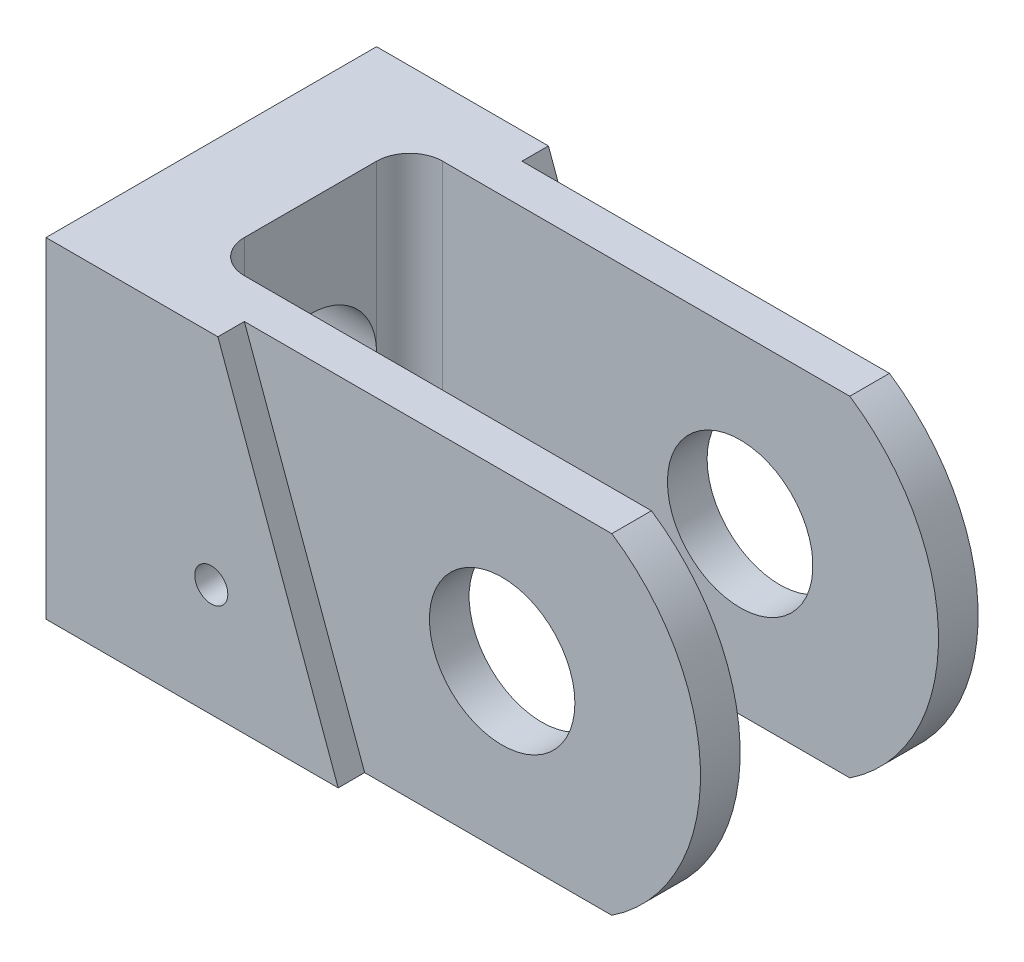
ISO-10303-21;
HEADER;
FILE_DESCRIPTION(('STEP AP214'),'2;1');
FILE_NAME('part.step','',(''),(''),'','','');
FILE_SCHEMA(('AUTOMOTIVE_DESIGN { 1 0 10303 214 1 1 1 1 }'));
ENDSEC;
DATA;
#1=APPLICATION_CONTEXT('core data for automotive mechanical design processes');
#2=APPLICATION_PROTOCOL_DEFINITION('international standard','automotive_design',2000,#1);
#3=PRODUCT_CONTEXT('',#1,'mechanical');
#4=PRODUCT('Part','Part','',(#3));
#5=PRODUCT_RELATED_PRODUCT_CATEGORY('part','',(#4));
#6=PRODUCT_DEFINITION_FORMATION('','',#4);
#7=PRODUCT_DEFINITION_CONTEXT('part definition',#1,'design');
#8=PRODUCT_DEFINITION('design','',#6,#7);
#9=PRODUCT_DEFINITION_SHAPE('','',#8);
#10=(LENGTH_UNIT() NAMED_UNIT(*) SI_UNIT(.MILLI.,.METRE.));
#11=(NAMED_UNIT(*) PLANE_ANGLE_UNIT() SI_UNIT($,.RADIAN.));
#12=(NAMED_UNIT(*) SI_UNIT($,.STERADIAN.) SOLID_ANGLE_UNIT());
#13=UNCERTAINTY_MEASURE_WITH_UNIT(LENGTH_MEASURE(1.E-05),#10,'distance_accuracy_value','');
#14=(GEOMETRIC_REPRESENTATION_CONTEXT(3) GLOBAL_UNCERTAINTY_ASSIGNED_CONTEXT((#13)) GLOBAL_UNIT_ASSIGNED_CONTEXT((#10,
#11,#12)) REPRESENTATION_CONTEXT('',''));
#15=CARTESIAN_POINT('',(0.,0.,0.));
#16=DIRECTION('',(0.,0.,1.));
#17=DIRECTION('',(1.,0.,0.));
#18=AXIS2_PLACEMENT_3D('',#15,#16,#17);
#19=CARTESIAN_POINT('',(-31.137339055794,-24.1952789699571,10.));
#20=DIRECTION('',(-1.,0.,0.));
#21=DIRECTION('',(0.,-1.,0.));
#22=AXIS2_PLACEMENT_3D('',#19,#20,#21);
#23=PLANE('',#22);
#24=DIRECTION('',(0.,0.,1.));
#25=VECTOR('',#24,1.);
#26=CARTESIAN_POINT('',(-31.137339055794,25.8047210300429,10.));
#27=LINE('',#26,#25);
#28=CARTESIAN_POINT('',(-31.137339055794,25.8047210300429,15.));
#29=VERTEX_POINT('',#28);
#30=CARTESIAN_POINT('',(-31.137339055794,25.8047210300429,35.));
#31=VERTEX_POINT('',#30);
#32=EDGE_CURVE('E229',#29,#31,#27,.T.);
#33=ORIENTED_EDGE('',*,*,#32,.T.);
#34=DIRECTION('',(0.,1.,0.));
#35=VECTOR('',#34,1.);
#36=CARTESIAN_POINT('',(-31.137339055794,-24.1952789699571,35.));
#37=LINE('',#36,#35);
#38=CARTESIAN_POINT('',(-31.137339055794,0.804721030042921,35.));
#39=VERTEX_POINT('',#38);
#40=EDGE_CURVE('E203',#31,#39,#37,.F.);
#41=ORIENTED_EDGE('',*,*,#40,.T.);
#42=CARTESIAN_POINT('',(-31.137339055794,0.804721030042921,25.));
#43=DIRECTION('',(-1.,0.,0.));
#44=DIRECTION('',(0.,-1.,0.));
#45=AXIS2_PLACEMENT_3D('',#42,#43,#44);
#46=CIRCLE('',#45,10.);
#47=CARTESIAN_POINT('',(-31.137339055794,0.804721030042921,15.));
#48=VERTEX_POINT('',#47);
#49=EDGE_CURVE('E183',#48,#39,#46,.F.);
#50=ORIENTED_EDGE('',*,*,#49,.F.);
#51=DIRECTION('',(0.,1.,0.));
#52=VECTOR('',#51,1.);
#53=CARTESIAN_POINT('',(-31.137339055794,25.8047210300429,15.));
#54=LINE('',#53,#52);
#55=EDGE_CURVE('E196',#48,#29,#54,.T.);
#56=ORIENTED_EDGE('',*,*,#55,.T.);
#57=EDGE_LOOP('',(#33,#41,#50,#56));
#58=FACE_BOUND('',#57,.T.);
#59=ADVANCED_FACE('F37',(#58),#23,.F.);
#60=CARTESIAN_POINT('',(18.862660944206,0.804721030042931,50.));
#61=DIRECTION('',(0.,0.,-1.));
#62=DIRECTION('',(-1.,0.,0.));
#63=AXIS2_PLACEMENT_3D('',#60,#61,#62);
#64=CYLINDRICAL_SURFACE('',#63,30.);
#65=DIRECTION('',(0.,0.,-1.));
#66=VECTOR('',#65,1.);
#67=CARTESIAN_POINT('',(35.445784895983,-24.1952789699571,50.));
#68=LINE('',#67,#66);
#69=CARTESIAN_POINT('',(35.445784895983,-24.1952789699571,46.));
#70=VERTEX_POINT('',#69);
#71=CARTESIAN_POINT('',(35.445784895983,-24.1952789699571,40.));
#72=VERTEX_POINT('',#71);
#73=EDGE_CURVE('E166',#70,#72,#68,.T.);
#74=ORIENTED_EDGE('',*,*,#73,.T.);
#75=CARTESIAN_POINT('',(18.862660944206,0.804721030042931,40.));
#76=DIRECTION('',(0.,0.,1.));
#77=DIRECTION('',(1.,0.,0.));
#78=AXIS2_PLACEMENT_3D('',#75,#76,#77);
#79=CIRCLE('',#78,30.);
#80=CARTESIAN_POINT('',(35.445784895983,25.8047210300429,40.));
#81=VERTEX_POINT('',#80);
#82=EDGE_CURVE('E223',#72,#81,#79,.T.);
#83=ORIENTED_EDGE('',*,*,#82,.T.);
#84=DIRECTION('',(0.,0.,-1.));
#85=VECTOR('',#84,1.);
#86=CARTESIAN_POINT('',(35.445784895983,25.8047210300429,50.));
#87=LINE('',#86,#85);
#88=CARTESIAN_POINT('',(35.445784895983,25.8047210300429,46.));
#89=VERTEX_POINT('',#88);
#90=EDGE_CURVE('E167',#89,#81,#87,.T.);
#91=ORIENTED_EDGE('',*,*,#90,.F.);
#92=CARTESIAN_POINT('',(18.862660944206,0.804721030042931,46.));
#93=DIRECTION('',(0.,0.,1.));
#94=DIRECTION('',(1.,0.,0.));
#95=AXIS2_PLACEMENT_3D('',#92,#93,#94);
#96=CIRCLE('',#95,30.);
#97=EDGE_CURVE('E270',#70,#89,#96,.T.);
#98=ORIENTED_EDGE('',*,*,#97,.F.);
#99=EDGE_LOOP('',(#74,#83,#91,#98));
#100=FACE_BOUND('',#99,.T.);
#101=ADVANCED_FACE('F334',(#100),#64,.T.);
#102=CARTESIAN_POINT('',(18.862660944206,0.804721030042931,50.));
#103=DIRECTION('',(0.,0.,-1.));
#104=DIRECTION('',(-1.,0.,0.));
#105=AXIS2_PLACEMENT_3D('',#102,#103,#104);
#106=CYLINDRICAL_SURFACE('',#105,11.);
#107=CARTESIAN_POINT('',(18.862660944206,0.804721030042931,40.));
#108=DIRECTION('',(0.,0.,1.));
#109=DIRECTION('',(1.,0.,0.));
#110=AXIS2_PLACEMENT_3D('',#107,#108,#109);
#111=CIRCLE('',#110,11.);
#112=CARTESIAN_POINT('',(29.862660944206,0.804721030042931,40.));
#113=VERTEX_POINT('',#112);
#114=EDGE_CURVE('E158',#113,#113,#111,.T.);
#115=ORIENTED_EDGE('',*,*,#114,.F.);
#116=EDGE_LOOP('',(#115));
#117=FACE_BOUND('',#116,.T.);
#118=CARTESIAN_POINT('',(18.862660944206,0.804721030042931,46.));
#119=DIRECTION('',(0.,0.,1.));
#120=DIRECTION('',(1.,0.,0.));
#121=AXIS2_PLACEMENT_3D('',#118,#119,#120);
#122=CIRCLE('',#121,11.);
#123=CARTESIAN_POINT('',(29.862660944206,0.804721030042931,46.));
#124=VERTEX_POINT('',#123);
#125=EDGE_CURVE('E259',#124,#124,#122,.F.);
#126=ORIENTED_EDGE('',*,*,#125,.F.);
#127=EDGE_LOOP('',(#126));
#128=FACE_BOUND('',#127,.T.);
#129=ADVANCED_FACE('F336',(#117,#128),#106,.F.);
#130=CARTESIAN_POINT('',(35.445784895983,25.8047210300429,10.));
#131=VERTEX_POINT('',#130);
#132=CARTESIAN_POINT('',(35.445784895983,25.8047210300429,4.));
#133=VERTEX_POINT('',#132);
#134=EDGE_CURVE('E157',#131,#133,#87,.T.);
#135=ORIENTED_EDGE('',*,*,#134,.F.);
#136=CARTESIAN_POINT('',(18.862660944206,0.804721030042931,10.));
#137=DIRECTION('',(0.,0.,-1.));
#138=DIRECTION('',(-1.,0.,0.));
#139=AXIS2_PLACEMENT_3D('',#136,#137,#138);
#140=CIRCLE('',#139,30.);
#141=CARTESIAN_POINT('',(35.445784895983,-24.1952789699571,10.));
#142=VERTEX_POINT('',#141);
#143=EDGE_CURVE('E144',#131,#142,#140,.T.);
#144=ORIENTED_EDGE('',*,*,#143,.T.);
#145=CARTESIAN_POINT('',(35.445784895983,-24.1952789699571,4.));
#146=VERTEX_POINT('',#145);
#147=EDGE_CURVE('E155',#142,#146,#68,.T.);
#148=ORIENTED_EDGE('',*,*,#147,.T.);
#149=CARTESIAN_POINT('',(18.862660944206,0.804721030042931,4.));
#150=DIRECTION('',(0.,0.,-1.));
#151=DIRECTION('',(-1.,0.,0.));
#152=AXIS2_PLACEMENT_3D('',#149,#150,#151);
#153=CIRCLE('',#152,30.);
#154=EDGE_CURVE('E249',#133,#146,#153,.T.);
#155=ORIENTED_EDGE('',*,*,#154,.F.);
#156=EDGE_LOOP('',(#135,#144,#148,#155));
#157=FACE_BOUND('',#156,.T.);
#158=ADVANCED_FACE('F153',(#157),#64,.T.);
#159=CARTESIAN_POINT('',(18.862660944206,0.804721030042931,10.));
#160=DIRECTION('',(0.,0.,-1.));
#161=DIRECTION('',(-1.,0.,0.));
#162=AXIS2_PLACEMENT_3D('',#159,#160,#161);
#163=CIRCLE('',#162,11.);
#164=CARTESIAN_POINT('',(7.86266094420602,0.804721030042931,10.));
#165=VERTEX_POINT('',#164);
#166=EDGE_CURVE('E159',#165,#165,#163,.T.);
#167=ORIENTED_EDGE('',*,*,#166,.F.);
#168=EDGE_LOOP('',(#167));
#169=FACE_BOUND('',#168,.T.);
#170=CARTESIAN_POINT('',(18.862660944206,0.804721030042931,4.));
#171=DIRECTION('',(0.,0.,-1.));
#172=DIRECTION('',(-1.,0.,0.));
#173=AXIS2_PLACEMENT_3D('',#170,#171,#172);
#174=CIRCLE('',#173,11.);
#175=CARTESIAN_POINT('',(7.86266094420602,0.804721030042931,4.));
#176=VERTEX_POINT('',#175);
#177=EDGE_CURVE('E252',#176,#176,#174,.F.);
#178=ORIENTED_EDGE('',*,*,#177,.F.);
#179=EDGE_LOOP('',(#178));
#180=FACE_BOUND('',#179,.T.);
#181=ADVANCED_FACE('F344',(#169,#180),#106,.F.);
#182=CARTESIAN_POINT('',(18.862660944206,0.804721030042931,50.));
#183=DIRECTION('',(0.,0.,1.));
#184=DIRECTION('',(1.,0.,0.));
#185=AXIS2_PLACEMENT_3D('',#182,#183,#184);
#186=PLANE('',#185);
#187=CARTESIAN_POINT('',(-21.137339055794,-7.19527896995708,50.));
#188=DIRECTION('',(0.,0.,1.));
#189=DIRECTION('',(1.,0.,0.));
#190=AXIS2_PLACEMENT_3D('',#187,#188,#189);
#191=CIRCLE('',#190,2.5);
#192=CARTESIAN_POINT('',(-18.637339055794,-7.19527896995708,50.));
#193=VERTEX_POINT('',#192);
#194=EDGE_CURVE('E605',#193,#193,#191,.T.);
#195=ORIENTED_EDGE('',*,*,#194,.F.);
#196=EDGE_LOOP('',(#195));
#197=FACE_BOUND('',#196,.T.);
#198=DIRECTION('',(1.,0.,0.));
#199=VECTOR('',#198,1.);
#200=CARTESIAN_POINT('',(35.445784895983,-24.1952789699571,50.));
#201=LINE('',#200,#199);
#202=CARTESIAN_POINT('',(-46.137339055794,-24.1952789699571,50.));
#203=VERTEX_POINT('',#202);
#204=CARTESIAN_POINT('',(-1.93882734248404,-24.1952789699571,50.));
#205=VERTEX_POINT('',#204);
#206=EDGE_CURVE('E290',#203,#205,#201,.T.);
#207=ORIENTED_EDGE('',*,*,#206,.T.);
#208=DIRECTION('',(-0.342020143325666,0.93969262078591,0.));
#209=VECTOR('',#208,1.);
#210=CARTESIAN_POINT('',(-7.54036057553245,-8.80519289783177,50.));
#211=LINE('',#210,#209);
#212=CARTESIAN_POINT('',(-20.137339055794,25.8047210300429,50.));
#213=VERTEX_POINT('',#212);
#214=EDGE_CURVE('E274',#205,#213,#211,.T.);
#215=ORIENTED_EDGE('',*,*,#214,.T.);
#216=DIRECTION('',(-1.,0.,0.));
#217=VECTOR('',#216,1.);
#218=CARTESIAN_POINT('',(35.445784895983,25.8047210300429,50.));
#219=LINE('',#218,#217);
#220=CARTESIAN_POINT('',(-46.137339055794,25.8047210300429,50.));
#221=VERTEX_POINT('',#220);
#222=EDGE_CURVE('E294',#213,#221,#219,.T.);
#223=ORIENTED_EDGE('',*,*,#222,.T.);
#224=DIRECTION('',(0.,-1.,0.));
#225=VECTOR('',#224,1.);
#226=CARTESIAN_POINT('',(-46.137339055794,-24.1952789699571,50.));
#227=LINE('',#226,#225);
#228=EDGE_CURVE('E287',#221,#203,#227,.T.);
#229=ORIENTED_EDGE('',*,*,#228,.T.);
#230=EDGE_LOOP('',(#207,#215,#223,#229));
#231=FACE_BOUND('',#230,.T.);
#232=ADVANCED_FACE('F323',(#197,#231),#186,.T.);
#233=CARTESIAN_POINT('',(35.445784895983,-24.1952789699571,50.));
#234=DIRECTION('',(0.,1.,0.));
#235=DIRECTION('',(-1.,0.,0.));
#236=AXIS2_PLACEMENT_3D('',#233,#234,#235);
#237=PLANE('',#236);
#238=DIRECTION('',(-1.,0.,0.));
#239=VECTOR('',#238,1.);
#240=CARTESIAN_POINT('',(-31.137339055794,-24.1952789699571,10.));
#241=LINE('',#240,#239);
#242=CARTESIAN_POINT('',(-26.137339055794,-24.1952789699571,10.));
#243=VERTEX_POINT('',#242);
#244=EDGE_CURVE('E141',#142,#243,#241,.T.);
#245=ORIENTED_EDGE('',*,*,#244,.T.);
#246=CARTESIAN_POINT('',(-26.137339055794,-24.1952789699571,15.));
#247=DIRECTION('',(0.,1.,0.));
#248=DIRECTION('',(-1.,0.,0.));
#249=AXIS2_PLACEMENT_3D('',#246,#247,#248);
#250=CIRCLE('',#249,5.);
#251=CARTESIAN_POINT('',(-31.137339055794,-24.1952789699571,15.));
#252=VERTEX_POINT('',#251);
#253=EDGE_CURVE('E11',#243,#252,#250,.T.);
#254=ORIENTED_EDGE('',*,*,#253,.T.);
#255=DIRECTION('',(0.,0.,1.));
#256=VECTOR('',#255,1.);
#257=CARTESIAN_POINT('',(-31.137339055794,-24.1952789699571,10.));
#258=LINE('',#257,#256);
#259=CARTESIAN_POINT('',(-31.137339055794,-24.1952789699571,35.));
#260=VERTEX_POINT('',#259);
#261=EDGE_CURVE('E149',#252,#260,#258,.T.);
#262=ORIENTED_EDGE('',*,*,#261,.T.);
#263=CARTESIAN_POINT('',(-26.137339055794,-24.1952789699571,35.));
#264=DIRECTION('',(0.,1.,0.));
#265=DIRECTION('',(-1.,0.,0.));
#266=AXIS2_PLACEMENT_3D('',#263,#264,#265);
#267=CIRCLE('',#266,5.);
#268=CARTESIAN_POINT('',(-26.137339055794,-24.1952789699571,40.));
#269=VERTEX_POINT('',#268);
#270=EDGE_CURVE('E208',#260,#269,#267,.T.);
#271=ORIENTED_EDGE('',*,*,#270,.T.);
#272=DIRECTION('',(1.,0.,0.));
#273=VECTOR('',#272,1.);
#274=CARTESIAN_POINT('',(-31.137339055794,-24.1952789699571,40.));
#275=LINE('',#274,#273);
#276=EDGE_CURVE('E213',#269,#72,#275,.T.);
#277=ORIENTED_EDGE('',*,*,#276,.T.);
#278=ORIENTED_EDGE('',*,*,#73,.F.);
#279=DIRECTION('',(1.,0.,0.));
#280=VECTOR('',#279,1.);
#281=CARTESIAN_POINT('',(0.,-24.1952789699571,46.));
#282=LINE('',#281,#280);
#283=CARTESIAN_POINT('',(-1.93882734248404,-24.1952789699571,46.));
#284=VERTEX_POINT('',#283);
#285=EDGE_CURVE('E268',#284,#70,#282,.T.);
#286=ORIENTED_EDGE('',*,*,#285,.F.);
#287=DIRECTION('',(0.,0.,-1.));
#288=VECTOR('',#287,1.);
#289=CARTESIAN_POINT('',(-1.93882734248404,-24.1952789699571,50.000012));
#290=LINE('',#289,#288);
#291=EDGE_CURVE('E272',#205,#284,#290,.T.);
#292=ORIENTED_EDGE('',*,*,#291,.F.);
#293=ORIENTED_EDGE('',*,*,#206,.F.);
#294=DIRECTION('',(0.,0.,-1.));
#295=VECTOR('',#294,1.);
#296=CARTESIAN_POINT('',(-46.137339055794,-24.1952789699571,50.));
#297=LINE('',#296,#295);
#298=CARTESIAN_POINT('',(-46.137339055794,-24.1952789699571,0.));
#299=VERTEX_POINT('',#298);
#300=EDGE_CURVE('E170',#203,#299,#297,.T.);
#301=ORIENTED_EDGE('',*,*,#300,.T.);
#302=DIRECTION('',(1.,0.,0.));
#303=VECTOR('',#302,1.);
#304=CARTESIAN_POINT('',(35.445784895983,-24.1952789699571,0.));
#305=LINE('',#304,#303);
#306=CARTESIAN_POINT('',(-1.93882734248406,-24.1952789699571,0.));
#307=VERTEX_POINT('',#306);
#308=EDGE_CURVE('E299',#299,#307,#305,.T.);
#309=ORIENTED_EDGE('',*,*,#308,.T.);
#310=DIRECTION('',(0.,0.,1.));
#311=VECTOR('',#310,1.);
#312=CARTESIAN_POINT('',(-1.93882734248406,-24.1952789699571,-1.2E-05));
#313=LINE('',#312,#311);
#314=CARTESIAN_POINT('',(-1.93882734248406,-24.1952789699571,4.));
#315=VERTEX_POINT('',#314);
#316=EDGE_CURVE('E255',#307,#315,#313,.T.);
#317=ORIENTED_EDGE('',*,*,#316,.T.);
#318=DIRECTION('',(-1.,0.,0.));
#319=VECTOR('',#318,1.);
#320=CARTESIAN_POINT('',(0.,-24.1952789699571,4.));
#321=LINE('',#320,#319);
#322=EDGE_CURVE('E165',#146,#315,#321,.T.);
#323=ORIENTED_EDGE('',*,*,#322,.F.);
#324=ORIENTED_EDGE('',*,*,#147,.F.);
#325=EDGE_LOOP('',(#245,#254,#262,#271,#277,#278,#286,#292,#293,#301,#309,#317,#323,#324));
#326=FACE_BOUND('',#325,.T.);
#327=ADVANCED_FACE('F162',(#326),#237,.F.);
#328=CARTESIAN_POINT('',(35.445784895983,25.8047210300429,50.));
#329=DIRECTION('',(0.,-1.,0.));
#330=DIRECTION('',(1.,0.,0.));
#331=AXIS2_PLACEMENT_3D('',#328,#329,#330);
#332=PLANE('',#331);
#333=ORIENTED_EDGE('',*,*,#90,.T.);
#334=DIRECTION('',(1.,0.,0.));
#335=VECTOR('',#334,1.);
#336=CARTESIAN_POINT('',(-31.137339055794,25.8047210300429,40.));
#337=LINE('',#336,#335);
#338=CARTESIAN_POINT('',(-26.137339055794,25.8047210300429,40.));
#339=VERTEX_POINT('',#338);
#340=EDGE_CURVE('E150',#339,#81,#337,.T.);
#341=ORIENTED_EDGE('',*,*,#340,.F.);
#342=CARTESIAN_POINT('',(-26.137339055794,25.8047210300429,35.));
#343=DIRECTION('',(0.,-1.,0.));
#344=DIRECTION('',(1.,0.,0.));
#345=AXIS2_PLACEMENT_3D('',#342,#343,#344);
#346=CIRCLE('',#345,5.);
#347=EDGE_CURVE('E206',#339,#31,#346,.T.);
#348=ORIENTED_EDGE('',*,*,#347,.T.);
#349=ORIENTED_EDGE('',*,*,#32,.F.);
#350=CARTESIAN_POINT('',(-26.137339055794,25.8047210300429,15.));
#351=DIRECTION('',(0.,-1.,0.));
#352=DIRECTION('',(1.,0.,0.));
#353=AXIS2_PLACEMENT_3D('',#350,#351,#352);
#354=CIRCLE('',#353,5.);
#355=CARTESIAN_POINT('',(-26.137339055794,25.8047210300429,10.));
#356=VERTEX_POINT('',#355);
#357=EDGE_CURVE('E45',#29,#356,#354,.T.);
#358=ORIENTED_EDGE('',*,*,#357,.T.);
#359=DIRECTION('',(1.,0.,0.));
#360=VECTOR('',#359,1.);
#361=CARTESIAN_POINT('',(35.445784895983,25.8047210300429,10.));
#362=LINE('',#361,#360);
#363=EDGE_CURVE('E182',#356,#131,#362,.T.);
#364=ORIENTED_EDGE('',*,*,#363,.T.);
#365=ORIENTED_EDGE('',*,*,#134,.T.);
#366=DIRECTION('',(1.,0.,0.));
#367=VECTOR('',#366,1.);
#368=CARTESIAN_POINT('',(0.,25.8047210300429,4.));
#369=LINE('',#368,#367);
#370=CARTESIAN_POINT('',(-20.137339055794,25.8047210300429,4.));
#371=VERTEX_POINT('',#370);
#372=EDGE_CURVE('E246',#371,#133,#369,.T.);
#373=ORIENTED_EDGE('',*,*,#372,.F.);
#374=DIRECTION('',(0.,0.,1.));
#375=VECTOR('',#374,1.);
#376=CARTESIAN_POINT('',(-20.137339055794,25.8047210300429,-1.2E-05));
#377=LINE('',#376,#375);
#378=CARTESIAN_POINT('',(-20.137339055794,25.8047210300429,0.));
#379=VERTEX_POINT('',#378);
#380=EDGE_CURVE('E257',#379,#371,#377,.T.);
#381=ORIENTED_EDGE('',*,*,#380,.F.);
#382=DIRECTION('',(-1.,0.,0.));
#383=VECTOR('',#382,1.);
#384=CARTESIAN_POINT('',(35.445784895983,25.8047210300429,0.));
#385=LINE('',#384,#383);
#386=CARTESIAN_POINT('',(-46.137339055794,25.8047210300429,0.));
#387=VERTEX_POINT('',#386);
#388=EDGE_CURVE('E291',#379,#387,#385,.T.);
#389=ORIENTED_EDGE('',*,*,#388,.T.);
#390=DIRECTION('',(0.,0.,-1.));
#391=VECTOR('',#390,1.);
#392=CARTESIAN_POINT('',(-46.137339055794,25.8047210300429,50.));
#393=LINE('',#392,#391);
#394=EDGE_CURVE('E296',#221,#387,#393,.T.);
#395=ORIENTED_EDGE('',*,*,#394,.F.);
#396=ORIENTED_EDGE('',*,*,#222,.F.);
#397=DIRECTION('',(0.,0.,1.));
#398=VECTOR('',#397,1.);
#399=CARTESIAN_POINT('',(-20.137339055794,25.8047210300429,50.));
#400=LINE('',#399,#398);
#401=CARTESIAN_POINT('',(-20.137339055794,25.8047210300429,46.));
#402=VERTEX_POINT('',#401);
#403=EDGE_CURVE('E177',#402,#213,#400,.T.);
#404=ORIENTED_EDGE('',*,*,#403,.F.);
#405=DIRECTION('',(-1.,0.,0.));
#406=VECTOR('',#405,1.);
#407=CARTESIAN_POINT('',(0.,25.8047210300429,46.));
#408=LINE('',#407,#406);
#409=EDGE_CURVE('E262',#89,#402,#408,.T.);
#410=ORIENTED_EDGE('',*,*,#409,.F.);
#411=EDGE_LOOP('',(#333,#341,#348,#349,#358,#364,#365,#373,#381,#389,#395,#396,#404,#410));
#412=FACE_BOUND('',#411,.T.);
#413=ADVANCED_FACE('F228',(#412),#332,.F.);
#414=CARTESIAN_POINT('',(18.862660944206,0.804721030042931,0.));
#415=DIRECTION('',(0.,0.,1.));
#416=DIRECTION('',(1.,0.,0.));
#417=AXIS2_PLACEMENT_3D('',#414,#415,#416);
#418=PLANE('',#417);
#419=CARTESIAN_POINT('',(-21.137339055794,-7.19527896995708,0.));
#420=DIRECTION('',(0.,0.,1.));
#421=DIRECTION('',(1.,0.,0.));
#422=AXIS2_PLACEMENT_3D('',#419,#420,#421);
#423=CIRCLE('',#422,2.5);
#424=CARTESIAN_POINT('',(-18.637339055794,-7.19527896995708,0.));
#425=VERTEX_POINT('',#424);
#426=EDGE_CURVE('E193',#425,#425,#423,.T.);
#427=ORIENTED_EDGE('',*,*,#426,.T.);
#428=EDGE_LOOP('',(#427));
#429=FACE_BOUND('',#428,.T.);
#430=ORIENTED_EDGE('',*,*,#388,.F.);
#431=DIRECTION('',(0.342020143325666,-0.93969262078591,0.));
#432=VECTOR('',#431,1.);
#433=CARTESIAN_POINT('',(-7.54036057553247,-8.80519289783177,0.));
#434=LINE('',#433,#432);
#435=EDGE_CURVE('E179',#379,#307,#434,.T.);
#436=ORIENTED_EDGE('',*,*,#435,.T.);
#437=ORIENTED_EDGE('',*,*,#308,.F.);
#438=DIRECTION('',(0.,-1.,0.));
#439=VECTOR('',#438,1.);
#440=CARTESIAN_POINT('',(-46.137339055794,-24.1952789699571,0.));
#441=LINE('',#440,#439);
#442=EDGE_CURVE('E284',#387,#299,#441,.T.);
#443=ORIENTED_EDGE('',*,*,#442,.F.);
#444=EDGE_LOOP('',(#430,#436,#437,#443));
#445=FACE_BOUND('',#444,.T.);
#446=ADVANCED_FACE('F317',(#429,#445),#418,.F.);
#447=CARTESIAN_POINT('',(-46.137339055794,-24.1952789699571,50.));
#448=DIRECTION('',(1.,0.,0.));
#449=DIRECTION('',(0.,0.,-1.));
#450=AXIS2_PLACEMENT_3D('',#447,#448,#449);
#451=PLANE('',#450);
#452=CARTESIAN_POINT('',(-46.137339055794,0.804721030042921,25.));
#453=DIRECTION('',(-1.,0.,0.));
#454=DIRECTION('',(0.,0.,1.));
#455=AXIS2_PLACEMENT_3D('',#452,#453,#454);
#456=CIRCLE('',#455,17.5);
#457=CARTESIAN_POINT('',(-46.137339055794,0.804721030042921,42.5));
#458=VERTEX_POINT('',#457);
#459=EDGE_CURVE('E280',#458,#458,#456,.T.);
#460=ORIENTED_EDGE('',*,*,#459,.F.);
#461=EDGE_LOOP('',(#460));
#462=FACE_BOUND('',#461,.T.);
#463=ORIENTED_EDGE('',*,*,#442,.T.);
#464=ORIENTED_EDGE('',*,*,#300,.F.);
#465=ORIENTED_EDGE('',*,*,#228,.F.);
#466=ORIENTED_EDGE('',*,*,#394,.T.);
#467=EDGE_LOOP('',(#463,#464,#465,#466));
#468=FACE_BOUND('',#467,.T.);
#469=ADVANCED_FACE('F319',(#462,#468),#451,.F.);
#470=CARTESIAN_POINT('',(-44.137339055794,0.804721030042921,25.));
#471=DIRECTION('',(-1.,0.,0.));
#472=DIRECTION('',(0.,0.,1.));
#473=AXIS2_PLACEMENT_3D('',#470,#471,#472);
#474=CYLINDRICAL_SURFACE('',#473,17.5);
#475=CARTESIAN_POINT('',(-44.137339055794,0.804721030042921,25.));
#476=DIRECTION('',(-1.,0.,0.));
#477=DIRECTION('',(0.,0.,1.));
#478=AXIS2_PLACEMENT_3D('',#475,#476,#477);
#479=CIRCLE('',#478,17.5);
#480=CARTESIAN_POINT('',(-44.137339055794,0.804721030042921,42.5));
#481=VERTEX_POINT('',#480);
#482=EDGE_CURVE('E281',#481,#481,#479,.T.);
#483=ORIENTED_EDGE('',*,*,#482,.F.);
#484=EDGE_LOOP('',(#483));
#485=FACE_BOUND('',#484,.T.);
#486=ORIENTED_EDGE('',*,*,#459,.T.);
#487=EDGE_LOOP('',(#486));
#488=FACE_BOUND('',#487,.T.);
#489=ADVANCED_FACE('F362',(#485,#488),#474,.F.);
#490=CARTESIAN_POINT('',(-44.137339055794,0.804721030042921,25.));
#491=DIRECTION('',(-1.,0.,0.));
#492=DIRECTION('',(0.,0.,1.));
#493=AXIS2_PLACEMENT_3D('',#490,#491,#492);
#494=PLANE('',#493);
#495=CARTESIAN_POINT('',(-44.137339055794,0.804721030042921,25.));
#496=DIRECTION('',(-1.,0.,0.));
#497=DIRECTION('',(0.,0.,1.));
#498=AXIS2_PLACEMENT_3D('',#495,#496,#497);
#499=CIRCLE('',#498,10.);
#500=CARTESIAN_POINT('',(-44.137339055794,0.804721030042921,35.));
#501=VERTEX_POINT('',#500);
#502=EDGE_CURVE('E277',#501,#501,#499,.T.);
#503=ORIENTED_EDGE('',*,*,#502,.F.);
#504=EDGE_LOOP('',(#503));
#505=FACE_BOUND('',#504,.T.);
#506=ORIENTED_EDGE('',*,*,#482,.T.);
#507=EDGE_LOOP('',(#506));
#508=FACE_BOUND('',#507,.T.);
#509=ADVANCED_FACE('F412',(#505,#508),#494,.T.);
#510=CARTESIAN_POINT('',(48.862660944206,0.804721030042921,25.));
#511=DIRECTION('',(-1.,0.,0.));
#512=DIRECTION('',(0.,0.,1.));
#513=AXIS2_PLACEMENT_3D('',#510,#511,#512);
#514=CYLINDRICAL_SURFACE('',#513,10.);
#515=ORIENTED_EDGE('',*,*,#49,.T.);
#516=EDGE_CURVE('E186',#39,#48,#46,.F.);
#517=ORIENTED_EDGE('',*,*,#516,.T.);
#518=EDGE_LOOP('',(#515,#517));
#519=FACE_BOUND('',#518,.T.);
#520=ORIENTED_EDGE('',*,*,#502,.T.);
#521=EDGE_LOOP('',(#520));
#522=FACE_BOUND('',#521,.T.);
#523=ADVANCED_FACE('F410',(#519,#522),#514,.F.);
#524=CARTESIAN_POINT('',(-9.48824039457934,-3.45343707918905,50.000012));
#525=DIRECTION('',(0.939692620785909,0.342020143325666,0.));
#526=DIRECTION('',(-0.342020143325666,0.93969262078591,0.));
#527=AXIS2_PLACEMENT_3D('',#524,#525,#526);
#528=PLANE('',#527);
#529=ORIENTED_EDGE('',*,*,#291,.T.);
#530=DIRECTION('',(0.342020143325666,-0.93969262078591,0.));
#531=VECTOR('',#530,1.);
#532=CARTESIAN_POINT('',(-9.48824039457934,-3.45343707918905,46.));
#533=LINE('',#532,#531);
#534=EDGE_CURVE('E265',#402,#284,#533,.T.);
#535=ORIENTED_EDGE('',*,*,#534,.F.);
#536=ORIENTED_EDGE('',*,*,#403,.T.);
#537=ORIENTED_EDGE('',*,*,#214,.F.);
#538=EDGE_LOOP('',(#529,#535,#536,#537));
#539=FACE_BOUND('',#538,.T.);
#540=ADVANCED_FACE('F329',(#539),#528,.T.);
#541=CARTESIAN_POINT('',(0.,0.,46.));
#542=DIRECTION('',(0.,0.,1.));
#543=DIRECTION('',(1.,0.,0.));
#544=AXIS2_PLACEMENT_3D('',#541,#542,#543);
#545=PLANE('',#544);
#546=ORIENTED_EDGE('',*,*,#125,.T.);
#547=EDGE_LOOP('',(#546));
#548=FACE_BOUND('',#547,.T.);
#549=ORIENTED_EDGE('',*,*,#409,.T.);
#550=ORIENTED_EDGE('',*,*,#534,.T.);
#551=ORIENTED_EDGE('',*,*,#285,.T.);
#552=ORIENTED_EDGE('',*,*,#97,.T.);
#553=EDGE_LOOP('',(#549,#550,#551,#552));
#554=FACE_BOUND('',#553,.T.);
#555=ADVANCED_FACE('F331',(#548,#554),#545,.T.);
#556=CARTESIAN_POINT('',(-9.48824039457935,-3.45343707918906,-1.2E-05));
#557=DIRECTION('',(-0.93969262078591,-0.342020143325666,0.));
#558=DIRECTION('',(0.342020143325666,-0.93969262078591,0.));
#559=AXIS2_PLACEMENT_3D('',#556,#557,#558);
#560=PLANE('',#559);
#561=ORIENTED_EDGE('',*,*,#380,.T.);
#562=DIRECTION('',(0.342020143325666,-0.93969262078591,0.));
#563=VECTOR('',#562,1.);
#564=CARTESIAN_POINT('',(-9.48824039457935,-3.45343707918906,4.));
#565=LINE('',#564,#563);
#566=EDGE_CURVE('E244',#371,#315,#565,.T.);
#567=ORIENTED_EDGE('',*,*,#566,.T.);
#568=ORIENTED_EDGE('',*,*,#316,.F.);
#569=ORIENTED_EDGE('',*,*,#435,.F.);
#570=EDGE_LOOP('',(#561,#567,#568,#569));
#571=FACE_BOUND('',#570,.T.);
#572=ADVANCED_FACE('F314',(#571),#560,.F.);
#573=CARTESIAN_POINT('',(0.,0.,4.));
#574=DIRECTION('',(0.,0.,-1.));
#575=DIRECTION('',(-1.,0.,0.));
#576=AXIS2_PLACEMENT_3D('',#573,#574,#575);
#577=PLANE('',#576);
#578=ORIENTED_EDGE('',*,*,#566,.F.);
#579=ORIENTED_EDGE('',*,*,#372,.T.);
#580=ORIENTED_EDGE('',*,*,#154,.T.);
#581=ORIENTED_EDGE('',*,*,#322,.T.);
#582=EDGE_LOOP('',(#578,#579,#580,#581));
#583=FACE_BOUND('',#582,.T.);
#584=ORIENTED_EDGE('',*,*,#177,.T.);
#585=EDGE_LOOP('',(#584));
#586=FACE_BOUND('',#585,.T.);
#587=ADVANCED_FACE('F311',(#583,#586),#577,.T.);
#588=CARTESIAN_POINT('',(-31.137339055794,-24.1952789699571,40.));
#589=DIRECTION('',(0.,0.,1.));
#590=DIRECTION('',(1.,0.,0.));
#591=AXIS2_PLACEMENT_3D('',#588,#589,#590);
#592=PLANE('',#591);
#593=CARTESIAN_POINT('',(-21.137339055794,-7.19527896995708,40.));
#594=DIRECTION('',(0.,0.,1.));
#595=DIRECTION('',(1.,0.,0.));
#596=AXIS2_PLACEMENT_3D('',#593,#594,#595);
#597=CIRCLE('',#596,2.5);
#598=CARTESIAN_POINT('',(-18.637339055794,-7.19527896995708,40.));
#599=VERTEX_POINT('',#598);
#600=EDGE_CURVE('E192',#599,#599,#597,.T.);
#601=ORIENTED_EDGE('',*,*,#600,.T.);
#602=EDGE_LOOP('',(#601));
#603=FACE_BOUND('',#602,.T.);
#604=ORIENTED_EDGE('',*,*,#114,.T.);
#605=EDGE_LOOP('',(#604));
#606=FACE_BOUND('',#605,.T.);
#607=ORIENTED_EDGE('',*,*,#276,.F.);
#608=DIRECTION('',(0.,1.,0.));
#609=VECTOR('',#608,1.);
#610=CARTESIAN_POINT('',(-26.137339055794,25.8047210300429,40.));
#611=LINE('',#610,#609);
#612=EDGE_CURVE('E188',#269,#339,#611,.T.);
#613=ORIENTED_EDGE('',*,*,#612,.T.);
#614=ORIENTED_EDGE('',*,*,#340,.T.);
#615=ORIENTED_EDGE('',*,*,#82,.F.);
#616=EDGE_LOOP('',(#607,#613,#614,#615));
#617=FACE_BOUND('',#616,.T.);
#618=ADVANCED_FACE('F220',(#603,#606,#617),#592,.F.);
#619=CARTESIAN_POINT('',(-31.137339055794,-24.1952789699571,10.));
#620=DIRECTION('',(0.,0.,-1.));
#621=DIRECTION('',(-1.,0.,0.));
#622=AXIS2_PLACEMENT_3D('',#619,#620,#621);
#623=PLANE('',#622);
#624=CARTESIAN_POINT('',(-21.137339055794,-7.19527896995708,10.));
#625=DIRECTION('',(0.,0.,-1.));
#626=DIRECTION('',(-1.,0.,0.));
#627=AXIS2_PLACEMENT_3D('',#624,#625,#626);
#628=CIRCLE('',#627,2.5);
#629=CARTESIAN_POINT('',(-23.637339055794,-7.19527896995708,10.));
#630=VERTEX_POINT('',#629);
#631=EDGE_CURVE('E189',#630,#630,#628,.T.);
#632=ORIENTED_EDGE('',*,*,#631,.T.);
#633=EDGE_LOOP('',(#632));
#634=FACE_BOUND('',#633,.T.);
#635=ORIENTED_EDGE('',*,*,#166,.T.);
#636=EDGE_LOOP('',(#635));
#637=FACE_BOUND('',#636,.T.);
#638=ORIENTED_EDGE('',*,*,#363,.F.);
#639=DIRECTION('',(0.,1.,0.));
#640=VECTOR('',#639,1.);
#641=CARTESIAN_POINT('',(-26.137339055794,-24.1952789699571,10.));
#642=LINE('',#641,#640);
#643=EDGE_CURVE('E52',#356,#243,#642,.F.);
#644=ORIENTED_EDGE('',*,*,#643,.T.);
#645=ORIENTED_EDGE('',*,*,#244,.F.);
#646=ORIENTED_EDGE('',*,*,#143,.F.);
#647=EDGE_LOOP('',(#638,#644,#645,#646));
#648=FACE_BOUND('',#647,.T.);
#649=ADVANCED_FACE('F143',(#634,#637,#648),#623,.F.);
#650=ORIENTED_EDGE('',*,*,#516,.F.);
#651=DIRECTION('',(0.,1.,0.));
#652=VECTOR('',#651,1.);
#653=CARTESIAN_POINT('',(-31.137339055794,-24.1952789699571,35.));
#654=LINE('',#653,#652);
#655=EDGE_CURVE('E201',#39,#260,#654,.F.);
#656=ORIENTED_EDGE('',*,*,#655,.T.);
#657=ORIENTED_EDGE('',*,*,#261,.F.);
#658=DIRECTION('',(0.,1.,0.));
#659=VECTOR('',#658,1.);
#660=CARTESIAN_POINT('',(-31.137339055794,25.8047210300429,15.));
#661=LINE('',#660,#659);
#662=EDGE_CURVE('E198',#252,#48,#661,.T.);
#663=ORIENTED_EDGE('',*,*,#662,.T.);
#664=EDGE_LOOP('',(#650,#656,#657,#663));
#665=FACE_BOUND('',#664,.T.);
#666=ADVANCED_FACE('F346',(#665),#23,.F.);
#667=CARTESIAN_POINT('',(-21.137339055794,-7.19527896995708,0.));
#668=DIRECTION('',(0.,0.,1.));
#669=DIRECTION('',(1.,0.,0.));
#670=AXIS2_PLACEMENT_3D('',#667,#668,#669);
#671=CYLINDRICAL_SURFACE('',#670,2.5);
#672=ORIENTED_EDGE('',*,*,#426,.F.);
#673=EDGE_LOOP('',(#672));
#674=FACE_BOUND('',#673,.T.);
#675=ORIENTED_EDGE('',*,*,#631,.F.);
#676=EDGE_LOOP('',(#675));
#677=FACE_BOUND('',#676,.T.);
#678=ADVANCED_FACE('F383',(#674,#677),#671,.F.);
#679=ORIENTED_EDGE('',*,*,#194,.T.);
#680=EDGE_LOOP('',(#679));
#681=FACE_BOUND('',#680,.T.);
#682=ORIENTED_EDGE('',*,*,#600,.F.);
#683=EDGE_LOOP('',(#682));
#684=FACE_BOUND('',#683,.T.);
#685=ADVANCED_FACE('F377',(#681,#684),#671,.F.);
#686=CARTESIAN_POINT('',(-26.137339055794,-24.1952789699571,35.));
#687=DIRECTION('',(0.,-1.,0.));
#688=DIRECTION('',(1.,0.,0.));
#689=AXIS2_PLACEMENT_3D('',#686,#687,#688);
#690=CYLINDRICAL_SURFACE('',#689,5.);
#691=ORIENTED_EDGE('',*,*,#655,.F.);
#692=ORIENTED_EDGE('',*,*,#40,.F.);
#693=ORIENTED_EDGE('',*,*,#347,.F.);
#694=ORIENTED_EDGE('',*,*,#612,.F.);
#695=ORIENTED_EDGE('',*,*,#270,.F.);
#696=EDGE_LOOP('',(#691,#692,#693,#694,#695));
#697=FACE_BOUND('',#696,.T.);
#698=ADVANCED_FACE('F225',(#697),#690,.F.);
#699=CARTESIAN_POINT('',(-26.137339055794,-24.1952789699571,15.));
#700=DIRECTION('',(0.,-1.,0.));
#701=DIRECTION('',(1.,0.,0.));
#702=AXIS2_PLACEMENT_3D('',#699,#700,#701);
#703=CYLINDRICAL_SURFACE('',#702,5.);
#704=ORIENTED_EDGE('',*,*,#253,.F.);
#705=ORIENTED_EDGE('',*,*,#643,.F.);
#706=ORIENTED_EDGE('',*,*,#357,.F.);
#707=ORIENTED_EDGE('',*,*,#55,.F.);
#708=ORIENTED_EDGE('',*,*,#662,.F.);
#709=EDGE_LOOP('',(#704,#705,#706,#707,#708));
#710=FACE_BOUND('',#709,.T.);
#711=ADVANCED_FACE('F39',(#710),#703,.F.);
#712=CLOSED_SHELL('',(#59,#101,#129,#158,#181,#232,#327,#413,#446,#469,#489,#509,#523,#540,#555,
#572,#587,#618,#649,#666,#678,#685,#698,#711));
#713=MANIFOLD_SOLID_BREP('B2',#712);
#714=ADVANCED_BREP_SHAPE_REPRESENTATION('',(#18,#713),#14);
#715=SHAPE_DEFINITION_REPRESENTATION(#9,#714);
ENDSEC;
END-ISO-10303-21;
